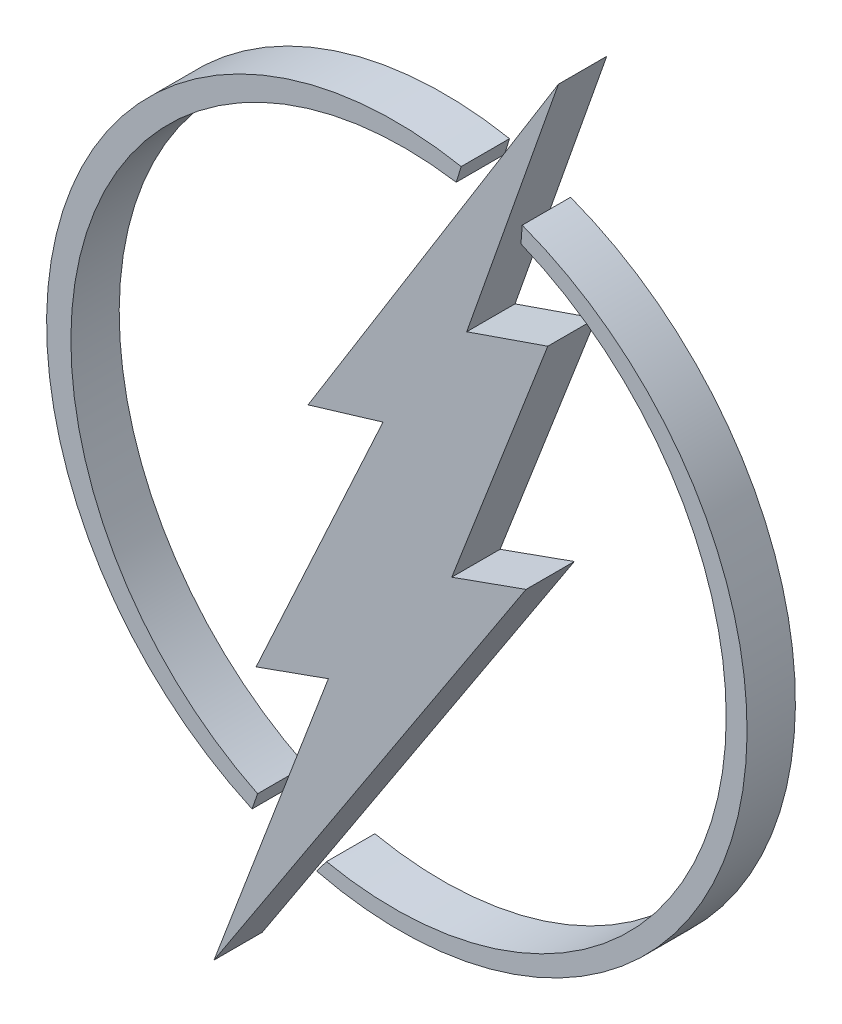
ISO-10303-21;
HEADER;
FILE_DESCRIPTION(('STEP AP214'),'2;1');
FILE_NAME('part.step','',(''),(''),'','','');
FILE_SCHEMA(('AUTOMOTIVE_DESIGN { 1 0 10303 214 1 1 1 1 }'));
ENDSEC;
DATA;
#1=APPLICATION_CONTEXT('core data for automotive mechanical design processes');
#2=APPLICATION_PROTOCOL_DEFINITION('international standard','automotive_design',2000,#1);
#3=PRODUCT_CONTEXT('',#1,'mechanical');
#4=PRODUCT('Part','Part','',(#3));
#5=PRODUCT_RELATED_PRODUCT_CATEGORY('part','',(#4));
#6=PRODUCT_DEFINITION_FORMATION('','',#4);
#7=PRODUCT_DEFINITION_CONTEXT('part definition',#1,'design');
#8=PRODUCT_DEFINITION('design','',#6,#7);
#9=PRODUCT_DEFINITION_SHAPE('','',#8);
#10=(LENGTH_UNIT() NAMED_UNIT(*) SI_UNIT(.MILLI.,.METRE.));
#11=(NAMED_UNIT(*) PLANE_ANGLE_UNIT() SI_UNIT($,.RADIAN.));
#12=(NAMED_UNIT(*) SI_UNIT($,.STERADIAN.) SOLID_ANGLE_UNIT());
#13=UNCERTAINTY_MEASURE_WITH_UNIT(LENGTH_MEASURE(1.E-05),#10,'distance_accuracy_value','');
#14=(GEOMETRIC_REPRESENTATION_CONTEXT(3) GLOBAL_UNCERTAINTY_ASSIGNED_CONTEXT((#13)) GLOBAL_UNIT_ASSIGNED_CONTEXT((#10,
#11,#12)) REPRESENTATION_CONTEXT('',''));
#15=CARTESIAN_POINT('',(0.,0.,0.));
#16=DIRECTION('',(0.,0.,1.));
#17=DIRECTION('',(1.,0.,0.));
#18=AXIS2_PLACEMENT_3D('',#15,#16,#17);
#19=CARTESIAN_POINT('',(5.5754752399908,6.72812446151738,1.4));
#20=DIRECTION('',(-0.943131605548492,0.332419576161698,0.));
#21=DIRECTION('',(-0.332419576161698,-0.943131605548492,0.));
#22=AXIS2_PLACEMENT_3D('',#19,#20,#21);
#23=PLANE('',#22);
#24=DIRECTION('',(0.332419576161698,0.943131605548492,0.));
#25=VECTOR('',#24,1.);
#26=CARTESIAN_POINT('',(5.5754752399908,6.72812446151738,1.));
#27=LINE('',#26,#25);
#28=CARTESIAN_POINT('',(5.5754752399908,6.72812446151738,1.));
#29=VERTEX_POINT('',#28);
#30=CARTESIAN_POINT('',(6.33493174900757,8.88283341387108,1.));
#31=VERTEX_POINT('',#30);
#32=EDGE_CURVE('E96',#29,#31,#27,.T.);
#33=ORIENTED_EDGE('',*,*,#32,.T.);
#34=DIRECTION('',(0.,0.,-1.));
#35=VECTOR('',#34,1.);
#36=CARTESIAN_POINT('',(6.33493174900757,8.88283341387108,1.4));
#37=LINE('',#36,#35);
#38=CARTESIAN_POINT('',(6.33493174900757,8.88283341387108,1.4));
#39=VERTEX_POINT('',#38);
#40=EDGE_CURVE('E129',#39,#31,#37,.T.);
#41=ORIENTED_EDGE('',*,*,#40,.F.);
#42=DIRECTION('',(0.332419576161698,0.943131605548492,0.));
#43=VECTOR('',#42,1.);
#44=CARTESIAN_POINT('',(5.5754752399908,6.72812446151738,1.4));
#45=LINE('',#44,#43);
#46=CARTESIAN_POINT('',(5.5754752399908,6.72812446151738,1.4));
#47=VERTEX_POINT('',#46);
#48=EDGE_CURVE('E48',#47,#39,#45,.T.);
#49=ORIENTED_EDGE('',*,*,#48,.F.);
#50=DIRECTION('',(0.,0.,-1.));
#51=VECTOR('',#50,1.);
#52=CARTESIAN_POINT('',(5.5754752399908,6.72812446151738,1.4));
#53=LINE('',#52,#51);
#54=EDGE_CURVE('E145',#47,#29,#53,.T.);
#55=ORIENTED_EDGE('',*,*,#54,.T.);
#56=EDGE_LOOP('',(#33,#41,#49,#55));
#57=FACE_BOUND('',#56,.T.);
#58=ADVANCED_FACE('F44',(#57),#23,.F.);
#59=CARTESIAN_POINT('',(6.33493174900757,8.88283341387108,1.4));
#60=DIRECTION('',(0.84935263624183,-0.527825822889571,0.));
#61=DIRECTION('',(0.527825822889571,0.84935263624183,0.));
#62=AXIS2_PLACEMENT_3D('',#59,#60,#61);
#63=PLANE('',#62);
#64=DIRECTION('',(-0.527825822889571,-0.84935263624183,0.));
#65=VECTOR('',#64,1.);
#66=CARTESIAN_POINT('',(6.33493174900757,8.88283341387108,1.));
#67=LINE('',#66,#65);
#68=CARTESIAN_POINT('',(4.26218458627314,5.54746558875507,1.));
#69=VERTEX_POINT('',#68);
#70=EDGE_CURVE('E63',#31,#69,#67,.T.);
#71=ORIENTED_EDGE('',*,*,#70,.T.);
#72=DIRECTION('',(0.,0.,-1.));
#73=VECTOR('',#72,1.);
#74=CARTESIAN_POINT('',(4.26218458627314,5.54746558875507,1.4));
#75=LINE('',#74,#73);
#76=CARTESIAN_POINT('',(4.26218458627314,5.54746558875507,1.4));
#77=VERTEX_POINT('',#76);
#78=EDGE_CURVE('E131',#77,#69,#75,.T.);
#79=ORIENTED_EDGE('',*,*,#78,.F.);
#80=DIRECTION('',(-0.527825822889571,-0.84935263624183,0.));
#81=VECTOR('',#80,1.);
#82=CARTESIAN_POINT('',(6.33493174900757,8.88283341387108,1.4));
#83=LINE('',#82,#81);
#84=EDGE_CURVE('E124',#39,#77,#83,.T.);
#85=ORIENTED_EDGE('',*,*,#84,.F.);
#86=ORIENTED_EDGE('',*,*,#40,.T.);
#87=EDGE_LOOP('',(#71,#79,#85,#86));
#88=FACE_BOUND('',#87,.T.);
#89=ADVANCED_FACE('F127',(#88),#63,.F.);
#90=CARTESIAN_POINT('',(4.26218458627314,5.54746558875507,1.4));
#91=DIRECTION('',(-0.287998020817134,0.957631004095739,0.));
#92=DIRECTION('',(-0.957631004095739,-0.287998020817134,0.));
#93=AXIS2_PLACEMENT_3D('',#90,#91,#92);
#94=PLANE('',#93);
#95=DIRECTION('',(0.957631004095739,0.287998020817134,0.));
#96=VECTOR('',#95,1.);
#97=CARTESIAN_POINT('',(4.26218458627314,5.54746558875507,1.));
#98=LINE('',#97,#96);
#99=CARTESIAN_POINT('',(4.88283020195723,5.73411859829775,1.));
#100=VERTEX_POINT('',#99);
#101=EDGE_CURVE('E141',#69,#100,#98,.T.);
#102=ORIENTED_EDGE('',*,*,#101,.T.);
#103=DIRECTION('',(0.,0.,-1.));
#104=VECTOR('',#103,1.);
#105=CARTESIAN_POINT('',(4.88283020195723,5.73411859829775,1.4));
#106=LINE('',#105,#104);
#107=CARTESIAN_POINT('',(4.88283020195723,5.73411859829775,1.4));
#108=VERTEX_POINT('',#107);
#109=EDGE_CURVE('E150',#108,#100,#106,.T.);
#110=ORIENTED_EDGE('',*,*,#109,.F.);
#111=DIRECTION('',(0.957631004095739,0.287998020817134,0.));
#112=VECTOR('',#111,1.);
#113=CARTESIAN_POINT('',(4.26218458627314,5.54746558875507,1.4));
#114=LINE('',#113,#112);
#115=EDGE_CURVE('E133',#77,#108,#114,.T.);
#116=ORIENTED_EDGE('',*,*,#115,.F.);
#117=ORIENTED_EDGE('',*,*,#78,.T.);
#118=EDGE_LOOP('',(#102,#110,#116,#117));
#119=FACE_BOUND('',#118,.T.);
#120=ADVANCED_FACE('F202',(#119),#94,.F.);
#121=CARTESIAN_POINT('',(4.88283020195723,5.73411859829775,1.4));
#122=DIRECTION('',(0.908219929787825,-0.418493200824336,0.));
#123=DIRECTION('',(0.418493200824336,0.908219929787825,0.));
#124=AXIS2_PLACEMENT_3D('',#121,#122,#123);
#125=PLANE('',#124);
#126=DIRECTION('',(-0.418493200824336,-0.908219929787825,0.));
#127=VECTOR('',#126,1.);
#128=CARTESIAN_POINT('',(4.88283020195723,5.73411859829775,1.));
#129=LINE('',#128,#127);
#130=CARTESIAN_POINT('',(3.83224500450119,3.4541235771357,1.));
#131=VERTEX_POINT('',#130);
#132=EDGE_CURVE('E149',#100,#131,#129,.T.);
#133=ORIENTED_EDGE('',*,*,#132,.T.);
#134=DIRECTION('',(0.,0.,-1.));
#135=VECTOR('',#134,1.);
#136=CARTESIAN_POINT('',(3.83224500450119,3.4541235771357,1.4));
#137=LINE('',#136,#135);
#138=CARTESIAN_POINT('',(3.83224500450119,3.4541235771357,1.4));
#139=VERTEX_POINT('',#138);
#140=EDGE_CURVE('E154',#139,#131,#137,.T.);
#141=ORIENTED_EDGE('',*,*,#140,.F.);
#142=DIRECTION('',(-0.418493200824336,-0.908219929787825,0.));
#143=VECTOR('',#142,1.);
#144=CARTESIAN_POINT('',(4.88283020195723,5.73411859829775,1.4));
#145=LINE('',#144,#143);
#146=EDGE_CURVE('E196',#108,#139,#145,.T.);
#147=ORIENTED_EDGE('',*,*,#146,.F.);
#148=ORIENTED_EDGE('',*,*,#109,.T.);
#149=EDGE_LOOP('',(#133,#141,#147,#148));
#150=FACE_BOUND('',#149,.T.);
#151=ADVANCED_FACE('F204',(#150),#125,.F.);
#152=CARTESIAN_POINT('',(3.83224500450119,3.4541235771357,1.4));
#153=DIRECTION('',(-0.336931622172441,0.941529119029384,0.));
#154=DIRECTION('',(-0.941529119029384,-0.336931622172441,0.));
#155=AXIS2_PLACEMENT_3D('',#152,#153,#154);
#156=PLANE('',#155);
#157=DIRECTION('',(0.941529119029384,0.336931622172441,0.));
#158=VECTOR('',#157,1.);
#159=CARTESIAN_POINT('',(3.83224500450119,3.4541235771357,1.));
#160=LINE('',#159,#158);
#161=CARTESIAN_POINT('',(4.43034059659642,3.66815553216071,1.));
#162=VERTEX_POINT('',#161);
#163=EDGE_CURVE('E153',#131,#162,#160,.T.);
#164=ORIENTED_EDGE('',*,*,#163,.T.);
#165=DIRECTION('',(0.,0.,-1.));
#166=VECTOR('',#165,1.);
#167=CARTESIAN_POINT('',(4.43034059659642,3.66815553216071,1.4));
#168=LINE('',#167,#166);
#169=CARTESIAN_POINT('',(4.43034059659642,3.66815553216071,1.4));
#170=VERTEX_POINT('',#169);
#171=EDGE_CURVE('E158',#170,#162,#168,.T.);
#172=ORIENTED_EDGE('',*,*,#171,.F.);
#173=DIRECTION('',(0.941529119029384,0.336931622172441,0.));
#174=VECTOR('',#173,1.);
#175=CARTESIAN_POINT('',(3.83224500450119,3.4541235771357,1.4));
#176=LINE('',#175,#174);
#177=EDGE_CURVE('E194',#139,#170,#176,.T.);
#178=ORIENTED_EDGE('',*,*,#177,.F.);
#179=ORIENTED_EDGE('',*,*,#140,.T.);
#180=EDGE_LOOP('',(#164,#172,#178,#179));
#181=FACE_BOUND('',#180,.T.);
#182=ADVANCED_FACE('F208',(#181),#156,.F.);
#183=CARTESIAN_POINT('',(4.43034059659642,3.66815553216071,1.4));
#184=DIRECTION('',(0.934740049512654,-0.355332294953725,0.));
#185=DIRECTION('',(0.355332294953725,0.934740049512654,0.));
#186=AXIS2_PLACEMENT_3D('',#183,#184,#185);
#187=PLANE('',#186);
#188=DIRECTION('',(-0.355332294953725,-0.934740049512654,0.));
#189=VECTOR('',#188,1.);
#190=CARTESIAN_POINT('',(4.43034059659642,3.66815553216071,1.));
#191=LINE('',#190,#189);
#192=CARTESIAN_POINT('',(3.48350957483978,1.17741408049454,1.));
#193=VERTEX_POINT('',#192);
#194=EDGE_CURVE('E157',#162,#193,#191,.T.);
#195=ORIENTED_EDGE('',*,*,#194,.T.);
#196=DIRECTION('',(0.,0.,-1.));
#197=VECTOR('',#196,1.);
#198=CARTESIAN_POINT('',(3.48350957483978,1.17741408049454,1.4));
#199=LINE('',#198,#197);
#200=CARTESIAN_POINT('',(3.48350957483978,1.17741408049454,1.4));
#201=VERTEX_POINT('',#200);
#202=EDGE_CURVE('E162',#201,#193,#199,.T.);
#203=ORIENTED_EDGE('',*,*,#202,.F.);
#204=DIRECTION('',(-0.355332294953725,-0.934740049512654,0.));
#205=VECTOR('',#204,1.);
#206=CARTESIAN_POINT('',(4.43034059659642,3.66815553216071,1.4));
#207=LINE('',#206,#205);
#208=EDGE_CURVE('E192',#170,#201,#207,.T.);
#209=ORIENTED_EDGE('',*,*,#208,.F.);
#210=ORIENTED_EDGE('',*,*,#171,.T.);
#211=EDGE_LOOP('',(#195,#203,#209,#210));
#212=FACE_BOUND('',#211,.T.);
#213=ADVANCED_FACE('F214',(#212),#187,.F.);
#214=CARTESIAN_POINT('',(3.48350957483978,1.17741408049454,1.4));
#215=DIRECTION('',(-0.83688934810245,0.547372102899532,0.));
#216=DIRECTION('',(-0.547372102899532,-0.83688934810245,0.));
#217=AXIS2_PLACEMENT_3D('',#214,#215,#216);
#218=PLANE('',#217);
#219=DIRECTION('',(0.547372102899532,0.83688934810245,0.));
#220=VECTOR('',#219,1.);
#221=CARTESIAN_POINT('',(3.48350957483978,1.17741408049454,1.));
#222=LINE('',#221,#220);
#223=CARTESIAN_POINT('',(6.06665986387478,5.12684984821021,1.));
#224=VERTEX_POINT('',#223);
#225=EDGE_CURVE('E161',#193,#224,#222,.T.);
#226=ORIENTED_EDGE('',*,*,#225,.T.);
#227=DIRECTION('',(0.,0.,-1.));
#228=VECTOR('',#227,1.);
#229=CARTESIAN_POINT('',(6.06665986387478,5.12684984821021,1.4));
#230=LINE('',#229,#228);
#231=CARTESIAN_POINT('',(6.06665986387478,5.12684984821021,1.4));
#232=VERTEX_POINT('',#231);
#233=EDGE_CURVE('E166',#232,#224,#230,.T.);
#234=ORIENTED_EDGE('',*,*,#233,.F.);
#235=DIRECTION('',(0.547372102899532,0.83688934810245,0.));
#236=VECTOR('',#235,1.);
#237=CARTESIAN_POINT('',(3.48350957483978,1.17741408049454,1.4));
#238=LINE('',#237,#236);
#239=EDGE_CURVE('E190',#201,#232,#238,.T.);
#240=ORIENTED_EDGE('',*,*,#239,.F.);
#241=ORIENTED_EDGE('',*,*,#202,.T.);
#242=EDGE_LOOP('',(#226,#234,#240,#241));
#243=FACE_BOUND('',#242,.T.);
#244=ADVANCED_FACE('F216',(#243),#218,.F.);
#245=CARTESIAN_POINT('',(6.06665986387478,5.12684984821021,1.4));
#246=DIRECTION('',(0.336931622172441,-0.941529119029384,0.));
#247=DIRECTION('',(0.941529119029384,0.336931622172441,0.));
#248=AXIS2_PLACEMENT_3D('',#245,#246,#247);
#249=PLANE('',#248);
#250=DIRECTION('',(-0.941529119029384,-0.336931622172441,0.));
#251=VECTOR('',#250,1.);
#252=CARTESIAN_POINT('',(6.06665986387478,5.12684984821021,1.));
#253=LINE('',#252,#251);
#254=CARTESIAN_POINT('',(5.45168227068719,4.90677657178728,1.));
#255=VERTEX_POINT('',#254);
#256=EDGE_CURVE('E165',#224,#255,#253,.T.);
#257=ORIENTED_EDGE('',*,*,#256,.T.);
#258=DIRECTION('',(0.,0.,-1.));
#259=VECTOR('',#258,1.);
#260=CARTESIAN_POINT('',(5.45168227068719,4.90677657178728,1.4));
#261=LINE('',#260,#259);
#262=CARTESIAN_POINT('',(5.45168227068719,4.90677657178728,1.4));
#263=VERTEX_POINT('',#262);
#264=EDGE_CURVE('E169',#263,#255,#261,.T.);
#265=ORIENTED_EDGE('',*,*,#264,.F.);
#266=DIRECTION('',(-0.941529119029384,-0.336931622172441,0.));
#267=VECTOR('',#266,1.);
#268=CARTESIAN_POINT('',(6.06665986387478,5.12684984821021,1.4));
#269=LINE('',#268,#267);
#270=EDGE_CURVE('E188',#232,#263,#269,.T.);
#271=ORIENTED_EDGE('',*,*,#270,.F.);
#272=ORIENTED_EDGE('',*,*,#233,.T.);
#273=EDGE_LOOP('',(#257,#265,#271,#272));
#274=FACE_BOUND('',#273,.T.);
#275=ADVANCED_FACE('F220',(#274),#249,.F.);
#276=CARTESIAN_POINT('',(5.45168227068719,4.90677657178728,1.4));
#277=DIRECTION('',(-0.932545562157118,0.361052315462821,0.));
#278=DIRECTION('',(-0.361052315462821,-0.932545562157118,0.));
#279=AXIS2_PLACEMENT_3D('',#276,#277,#278);
#280=PLANE('',#279);
#281=DIRECTION('',(0.361052315462821,0.932545562157118,0.));
#282=VECTOR('',#281,1.);
#283=CARTESIAN_POINT('',(5.45168227068719,4.90677657178728,1.));
#284=LINE('',#283,#282);
#285=CARTESIAN_POINT('',(6.24671541544286,6.96023142904068,1.));
#286=VERTEX_POINT('',#285);
#287=EDGE_CURVE('E88',#255,#286,#284,.T.);
#288=ORIENTED_EDGE('',*,*,#287,.T.);
#289=DIRECTION('',(0.,0.,-1.));
#290=VECTOR('',#289,1.);
#291=CARTESIAN_POINT('',(6.24671541544286,6.96023142904068,1.4));
#292=LINE('',#291,#290);
#293=CARTESIAN_POINT('',(6.24671541544286,6.96023142904068,1.4));
#294=VERTEX_POINT('',#293);
#295=EDGE_CURVE('E140',#294,#286,#292,.T.);
#296=ORIENTED_EDGE('',*,*,#295,.F.);
#297=DIRECTION('',(0.361052315462821,0.932545562157118,0.));
#298=VECTOR('',#297,1.);
#299=CARTESIAN_POINT('',(5.45168227068719,4.90677657178728,1.4));
#300=LINE('',#299,#298);
#301=EDGE_CURVE('E54',#263,#294,#300,.T.);
#302=ORIENTED_EDGE('',*,*,#301,.F.);
#303=ORIENTED_EDGE('',*,*,#264,.T.);
#304=EDGE_LOOP('',(#288,#296,#302,#303));
#305=FACE_BOUND('',#304,.T.);
#306=ADVANCED_FACE('F224',(#305),#280,.F.);
#307=CARTESIAN_POINT('',(6.24671541544286,6.96023142904068,1.4));
#308=DIRECTION('',(0.32680199790554,-0.945092828332195,0.));
#309=DIRECTION('',(0.945092828332195,0.32680199790554,0.));
#310=AXIS2_PLACEMENT_3D('',#307,#308,#309);
#311=PLANE('',#310);
#312=DIRECTION('',(-0.945092828332195,-0.32680199790554,0.));
#313=VECTOR('',#312,1.);
#314=CARTESIAN_POINT('',(6.24671541544286,6.96023142904068,1.));
#315=LINE('',#314,#313);
#316=EDGE_CURVE('E92',#286,#29,#315,.T.);
#317=ORIENTED_EDGE('',*,*,#316,.T.);
#318=ORIENTED_EDGE('',*,*,#54,.F.);
#319=DIRECTION('',(-0.945092828332195,-0.32680199790554,0.));
#320=VECTOR('',#319,1.);
#321=CARTESIAN_POINT('',(6.24671541544286,6.96023142904068,1.4));
#322=LINE('',#321,#320);
#323=EDGE_CURVE('E12',#294,#47,#322,.T.);
#324=ORIENTED_EDGE('',*,*,#323,.F.);
#325=ORIENTED_EDGE('',*,*,#295,.T.);
#326=EDGE_LOOP('',(#317,#318,#324,#325));
#327=FACE_BOUND('',#326,.T.);
#328=ADVANCED_FACE('F226',(#327),#311,.F.);
#329=CARTESIAN_POINT('',(0.,0.,1.4));
#330=DIRECTION('',(0.,0.,-1.));
#331=DIRECTION('',(-1.,0.,0.));
#332=AXIS2_PLACEMENT_3D('',#329,#330,#331);
#333=PLANE('',#332);
#334=ORIENTED_EDGE('',*,*,#48,.T.);
#335=ORIENTED_EDGE('',*,*,#84,.T.);
#336=ORIENTED_EDGE('',*,*,#115,.T.);
#337=ORIENTED_EDGE('',*,*,#146,.T.);
#338=ORIENTED_EDGE('',*,*,#177,.T.);
#339=ORIENTED_EDGE('',*,*,#208,.T.);
#340=ORIENTED_EDGE('',*,*,#239,.T.);
#341=ORIENTED_EDGE('',*,*,#270,.T.);
#342=ORIENTED_EDGE('',*,*,#301,.T.);
#343=ORIENTED_EDGE('',*,*,#323,.T.);
#344=EDGE_LOOP('',(#334,#335,#336,#337,#338,#339,#340,#341,#342,#343));
#345=FACE_BOUND('',#344,.T.);
#346=ADVANCED_FACE('F135',(#345),#333,.F.);
#347=CARTESIAN_POINT('',(0.,0.,1.));
#348=DIRECTION('',(0.,0.,-1.));
#349=DIRECTION('',(-1.,0.,0.));
#350=AXIS2_PLACEMENT_3D('',#347,#348,#349);
#351=PLANE('',#350);
#352=ORIENTED_EDGE('',*,*,#32,.F.);
#353=ORIENTED_EDGE('',*,*,#316,.F.);
#354=ORIENTED_EDGE('',*,*,#287,.F.);
#355=ORIENTED_EDGE('',*,*,#256,.F.);
#356=ORIENTED_EDGE('',*,*,#225,.F.);
#357=ORIENTED_EDGE('',*,*,#194,.F.);
#358=ORIENTED_EDGE('',*,*,#163,.F.);
#359=ORIENTED_EDGE('',*,*,#132,.F.);
#360=ORIENTED_EDGE('',*,*,#101,.F.);
#361=ORIENTED_EDGE('',*,*,#70,.F.);
#362=EDGE_LOOP('',(#352,#353,#354,#355,#356,#357,#358,#359,#360,#361));
#363=FACE_BOUND('',#362,.T.);
#364=ADVANCED_FACE('F46',(#363),#351,.T.);
#365=CLOSED_SHELL('',(#58,#89,#120,#151,#182,#213,#244,#275,#306,#328,#346,#364));
#366=MANIFOLD_SOLID_BREP('B2',#365);
#367=CARTESIAN_POINT('',(5.05914994349455,5.02952218568989,1.4));
#368=DIRECTION('',(0.,0.,1.));
#369=DIRECTION('',(1.,0.,0.));
#370=AXIS2_PLACEMENT_3D('',#367,#368,#369);
#371=PLANE('',#370);
#372=CARTESIAN_POINT('',(5.05914994349455,5.02952218568989,1.4));
#373=DIRECTION('',(0.,0.,-1.));
#374=DIRECTION('',(1.,0.,0.));
#375=AXIS2_PLACEMENT_3D('',#372,#373,#374);
#376=CIRCLE('',#375,2.76040884083673);
#377=CARTESIAN_POINT('',(3.84441176195249,2.55075876033573,1.4));
#378=VERTEX_POINT('',#377);
#379=CARTESIAN_POINT('',(5.48850418447344,7.75633569312362,1.4));
#380=VERTEX_POINT('',#379);
#381=EDGE_CURVE('E337',#378,#380,#376,.T.);
#382=ORIENTED_EDGE('',*,*,#381,.T.);
#383=DIRECTION('',(0.297546452170526,0.954707341964402,0.));
#384=VECTOR('',#383,1.);
#385=CARTESIAN_POINT('',(5.53016977084519,7.89002386492399,1.4));
#386=LINE('',#385,#384);
#387=CARTESIAN_POINT('',(5.53016977084519,7.89002386492399,1.4));
#388=VERTEX_POINT('',#387);
#389=EDGE_CURVE('E399',#380,#388,#386,.T.);
#390=ORIENTED_EDGE('',*,*,#389,.T.);
#391=CARTESIAN_POINT('',(4.98710817993812,5.05213931217201,1.4));
#392=DIRECTION('',(0.,0.,1.));
#393=DIRECTION('',(-1.,0.,0.));
#394=AXIS2_PLACEMENT_3D('',#391,#392,#393);
#395=CIRCLE('',#394,2.88937789606462);
#396=CARTESIAN_POINT('',(3.79849213367489,2.41856825354603,1.4));
#397=VERTEX_POINT('',#396);
#398=EDGE_CURVE('E398',#388,#397,#395,.T.);
#399=ORIENTED_EDGE('',*,*,#398,.T.);
#400=DIRECTION('',(0.328140164216985,0.944629044984141,0.));
#401=VECTOR('',#400,1.);
#402=CARTESIAN_POINT('',(3.79849213367489,2.41856825354603,1.4));
#403=LINE('',#402,#401);
#404=EDGE_CURVE('E378',#397,#378,#403,.T.);
#405=ORIENTED_EDGE('',*,*,#404,.T.);
#406=EDGE_LOOP('',(#382,#390,#399,#405));
#407=FACE_BOUND('',#406,.T.);
#408=ADVANCED_FACE('F333',(#407),#371,.T.);
#409=CARTESIAN_POINT('',(3.79849213367489,2.41856825354603,1.4));
#410=DIRECTION('',(-0.944629044984141,0.328140164216985,0.));
#411=DIRECTION('',(-0.328140164216985,-0.944629044984141,0.));
#412=AXIS2_PLACEMENT_3D('',#409,#410,#411);
#413=PLANE('',#412);
#414=DIRECTION('',(0.328140164216985,0.944629044984141,0.));
#415=VECTOR('',#414,1.);
#416=CARTESIAN_POINT('',(3.79849213367489,2.41856825354603,1.));
#417=LINE('',#416,#415);
#418=CARTESIAN_POINT('',(3.79849213367489,2.41856825354603,1.));
#419=VERTEX_POINT('',#418);
#420=CARTESIAN_POINT('',(3.84441176195249,2.55075876033573,1.));
#421=VERTEX_POINT('',#420);
#422=EDGE_CURVE('E371',#419,#421,#417,.T.);
#423=ORIENTED_EDGE('',*,*,#422,.T.);
#424=DIRECTION('',(0.,0.,-1.));
#425=VECTOR('',#424,1.);
#426=CARTESIAN_POINT('',(3.84441176195249,2.55075876033573,1.4));
#427=LINE('',#426,#425);
#428=EDGE_CURVE('E42',#378,#421,#427,.T.);
#429=ORIENTED_EDGE('',*,*,#428,.F.);
#430=ORIENTED_EDGE('',*,*,#404,.F.);
#431=DIRECTION('',(0.,0.,-1.));
#432=VECTOR('',#431,1.);
#433=CARTESIAN_POINT('',(3.79849213367489,2.41856825354603,1.4));
#434=LINE('',#433,#432);
#435=EDGE_CURVE('E377',#397,#419,#434,.T.);
#436=ORIENTED_EDGE('',*,*,#435,.T.);
#437=EDGE_LOOP('',(#423,#429,#430,#436));
#438=FACE_BOUND('',#437,.T.);
#439=ADVANCED_FACE('F389',(#438),#413,.F.);
#440=CARTESIAN_POINT('',(4.98710817993812,5.05213931217201,1.4));
#441=DIRECTION('',(0.,0.,-1.));
#442=DIRECTION('',(-1.,0.,0.));
#443=AXIS2_PLACEMENT_3D('',#440,#441,#442);
#444=CYLINDRICAL_SURFACE('',#443,2.88937789606462);
#445=CARTESIAN_POINT('',(4.98710817993812,5.05213931217201,1.));
#446=DIRECTION('',(0.,0.,1.));
#447=DIRECTION('',(-1.,0.,0.));
#448=AXIS2_PLACEMENT_3D('',#445,#446,#447);
#449=CIRCLE('',#448,2.88937789606462);
#450=CARTESIAN_POINT('',(5.53016977084519,7.89002386492399,1.));
#451=VERTEX_POINT('',#450);
#452=EDGE_CURVE('E373',#451,#419,#449,.T.);
#453=ORIENTED_EDGE('',*,*,#452,.T.);
#454=ORIENTED_EDGE('',*,*,#435,.F.);
#455=ORIENTED_EDGE('',*,*,#398,.F.);
#456=DIRECTION('',(0.,0.,-1.));
#457=VECTOR('',#456,1.);
#458=CARTESIAN_POINT('',(5.53016977084519,7.89002386492399,1.4));
#459=LINE('',#458,#457);
#460=EDGE_CURVE('E387',#388,#451,#459,.T.);
#461=ORIENTED_EDGE('',*,*,#460,.T.);
#462=EDGE_LOOP('',(#453,#454,#455,#461));
#463=FACE_BOUND('',#462,.T.);
#464=ADVANCED_FACE('F383',(#463),#444,.T.);
#465=CARTESIAN_POINT('',(5.53016977084519,7.89002386492399,1.4));
#466=DIRECTION('',(-0.954707341964402,0.297546452170525,0.));
#467=DIRECTION('',(-0.297546452170525,-0.954707341964402,0.));
#468=AXIS2_PLACEMENT_3D('',#465,#466,#467);
#469=PLANE('',#468);
#470=DIRECTION('',(0.297546452170526,0.954707341964402,0.));
#471=VECTOR('',#470,1.);
#472=CARTESIAN_POINT('',(5.53016977084519,7.89002386492399,1.));
#473=LINE('',#472,#471);
#474=CARTESIAN_POINT('',(5.48850418447344,7.75633569312362,1.));
#475=VERTEX_POINT('',#474);
#476=EDGE_CURVE('E352',#475,#451,#473,.T.);
#477=ORIENTED_EDGE('',*,*,#476,.T.);
#478=ORIENTED_EDGE('',*,*,#460,.F.);
#479=ORIENTED_EDGE('',*,*,#389,.F.);
#480=DIRECTION('',(0.,0.,-1.));
#481=VECTOR('',#480,1.);
#482=CARTESIAN_POINT('',(5.48850418447344,7.75633569312362,1.4));
#483=LINE('',#482,#481);
#484=EDGE_CURVE('E395',#380,#475,#483,.T.);
#485=ORIENTED_EDGE('',*,*,#484,.T.);
#486=EDGE_LOOP('',(#477,#478,#479,#485));
#487=FACE_BOUND('',#486,.T.);
#488=ADVANCED_FACE('F407',(#487),#469,.F.);
#489=CARTESIAN_POINT('',(5.05914994349455,5.02952218568989,1.4));
#490=DIRECTION('',(0.,0.,-1.));
#491=DIRECTION('',(-1.,0.,0.));
#492=AXIS2_PLACEMENT_3D('',#489,#490,#491);
#493=CYLINDRICAL_SURFACE('',#492,2.76040884083673);
#494=CARTESIAN_POINT('',(5.05914994349455,5.02952218568989,1.));
#495=DIRECTION('',(0.,0.,-1.));
#496=DIRECTION('',(1.,0.,0.));
#497=AXIS2_PLACEMENT_3D('',#494,#495,#496);
#498=CIRCLE('',#497,2.76040884083673);
#499=EDGE_CURVE('E343',#421,#475,#498,.T.);
#500=ORIENTED_EDGE('',*,*,#499,.T.);
#501=ORIENTED_EDGE('',*,*,#484,.F.);
#502=ORIENTED_EDGE('',*,*,#381,.F.);
#503=ORIENTED_EDGE('',*,*,#428,.T.);
#504=EDGE_LOOP('',(#500,#501,#502,#503));
#505=FACE_BOUND('',#504,.T.);
#506=ADVANCED_FACE('F405',(#505),#493,.F.);
#507=CARTESIAN_POINT('',(0.,0.,1.));
#508=DIRECTION('',(0.,0.,-1.));
#509=DIRECTION('',(-1.,0.,0.));
#510=AXIS2_PLACEMENT_3D('',#507,#508,#509);
#511=PLANE('',#510);
#512=ORIENTED_EDGE('',*,*,#499,.F.);
#513=ORIENTED_EDGE('',*,*,#422,.F.);
#514=ORIENTED_EDGE('',*,*,#452,.F.);
#515=ORIENTED_EDGE('',*,*,#476,.F.);
#516=EDGE_LOOP('',(#512,#513,#514,#515));
#517=FACE_BOUND('',#516,.T.);
#518=ADVANCED_FACE('F335',(#517),#511,.T.);
#519=CLOSED_SHELL('',(#408,#439,#464,#488,#506,#518));
#520=MANIFOLD_SOLID_BREP('B6',#519);
#521=CARTESIAN_POINT('',(5.02169165891347,5.03218816207093,1.4));
#522=DIRECTION('',(0.,0.,-1.));
#523=DIRECTION('',(-1.,0.,0.));
#524=AXIS2_PLACEMENT_3D('',#521,#522,#523);
#525=PLANE('',#524);
#526=CARTESIAN_POINT('',(5.02169165891347,5.03218816207093,1.4));
#527=DIRECTION('',(0.,0.,1.));
#528=DIRECTION('',(-1.,0.,0.));
#529=AXIS2_PLACEMENT_3D('',#526,#527,#528);
#530=CIRCLE('',#529,2.87476036646796);
#531=CARTESIAN_POINT('',(4.33325402482021,2.24107713085431,1.4));
#532=VERTEX_POINT('',#531);
#533=CARTESIAN_POINT('',(6.0352377506101,7.72235014318312,1.4));
#534=VERTEX_POINT('',#533);
#535=EDGE_CURVE('E504',#532,#534,#530,.T.);
#536=ORIENTED_EDGE('',*,*,#535,.T.);
#537=DIRECTION('',(-0.0772074385865055,-0.99701505075245,0.));
#538=VECTOR('',#537,1.);
#539=CARTESIAN_POINT('',(6.02444218329046,7.58294203308196,1.4));
#540=LINE('',#539,#538);
#541=CARTESIAN_POINT('',(6.02444218329046,7.58294203308196,1.4));
#542=VERTEX_POINT('',#541);
#543=EDGE_CURVE('E525',#534,#542,#540,.T.);
#544=ORIENTED_EDGE('',*,*,#543,.T.);
#545=CARTESIAN_POINT('',(4.97402403943136,5.04176586294974,1.4));
#546=DIRECTION('',(0.,0.,-1.));
#547=DIRECTION('',(1.,0.,0.));
#548=AXIS2_PLACEMENT_3D('',#545,#546,#547);
#549=CIRCLE('',#548,2.74971900466143);
#550=CARTESIAN_POINT('',(4.4151419315952,2.34944244364499,1.4));
#551=VERTEX_POINT('',#550);
#552=EDGE_CURVE('E523',#542,#551,#549,.T.);
#553=ORIENTED_EDGE('',*,*,#552,.T.);
#554=DIRECTION('',(-0.602888826572247,-0.797825208171777,0.));
#555=VECTOR('',#554,1.);
#556=CARTESIAN_POINT('',(4.4151419315952,2.34944244364499,1.4));
#557=LINE('',#556,#555);
#558=EDGE_CURVE('E473',#551,#532,#557,.T.);
#559=ORIENTED_EDGE('',*,*,#558,.T.);
#560=EDGE_LOOP('',(#536,#544,#553,#559));
#561=FACE_BOUND('',#560,.T.);
#562=ADVANCED_FACE('F457',(#561),#525,.F.);
#563=CARTESIAN_POINT('',(4.4151419315952,2.34944244364499,1.4));
#564=DIRECTION('',(0.797825208171777,-0.602888826572247,0.));
#565=DIRECTION('',(0.602888826572247,0.797825208171777,0.));
#566=AXIS2_PLACEMENT_3D('',#563,#564,#565);
#567=PLANE('',#566);
#568=DIRECTION('',(-0.602888826572247,-0.797825208171777,0.));
#569=VECTOR('',#568,1.);
#570=CARTESIAN_POINT('',(4.4151419315952,2.34944244364499,1.));
#571=LINE('',#570,#569);
#572=CARTESIAN_POINT('',(4.4151419315952,2.34944244364499,1.));
#573=VERTEX_POINT('',#572);
#574=CARTESIAN_POINT('',(4.33325402482021,2.24107713085431,1.));
#575=VERTEX_POINT('',#574);
#576=EDGE_CURVE('E494',#573,#575,#571,.T.);
#577=ORIENTED_EDGE('',*,*,#576,.T.);
#578=DIRECTION('',(0.,0.,-1.));
#579=VECTOR('',#578,1.);
#580=CARTESIAN_POINT('',(4.33325402482021,2.24107713085431,1.4));
#581=LINE('',#580,#579);
#582=EDGE_CURVE('E516',#532,#575,#581,.T.);
#583=ORIENTED_EDGE('',*,*,#582,.F.);
#584=ORIENTED_EDGE('',*,*,#558,.F.);
#585=DIRECTION('',(0.,0.,-1.));
#586=VECTOR('',#585,1.);
#587=CARTESIAN_POINT('',(4.4151419315952,2.34944244364499,1.4));
#588=LINE('',#587,#586);
#589=EDGE_CURVE('E511',#551,#573,#588,.T.);
#590=ORIENTED_EDGE('',*,*,#589,.T.);
#591=EDGE_LOOP('',(#577,#583,#584,#590));
#592=FACE_BOUND('',#591,.T.);
#593=ADVANCED_FACE('F515',(#592),#567,.F.);
#594=CARTESIAN_POINT('',(4.97402403943136,5.04176586294974,1.4));
#595=DIRECTION('',(0.,0.,-1.));
#596=DIRECTION('',(-1.,0.,0.));
#597=AXIS2_PLACEMENT_3D('',#594,#595,#596);
#598=CYLINDRICAL_SURFACE('',#597,2.74971900466143);
#599=CARTESIAN_POINT('',(4.97402403943136,5.04176586294974,1.));
#600=DIRECTION('',(0.,0.,-1.));
#601=DIRECTION('',(1.,0.,0.));
#602=AXIS2_PLACEMENT_3D('',#599,#600,#601);
#603=CIRCLE('',#602,2.74971900466143);
#604=CARTESIAN_POINT('',(6.02444218329046,7.58294203308196,1.));
#605=VERTEX_POINT('',#604);
#606=EDGE_CURVE('E497',#605,#573,#603,.T.);
#607=ORIENTED_EDGE('',*,*,#606,.T.);
#608=ORIENTED_EDGE('',*,*,#589,.F.);
#609=ORIENTED_EDGE('',*,*,#552,.F.);
#610=DIRECTION('',(0.,0.,-1.));
#611=VECTOR('',#610,1.);
#612=CARTESIAN_POINT('',(6.02444218329046,7.58294203308196,1.4));
#613=LINE('',#612,#611);
#614=EDGE_CURVE('E466',#542,#605,#613,.T.);
#615=ORIENTED_EDGE('',*,*,#614,.T.);
#616=EDGE_LOOP('',(#607,#608,#609,#615));
#617=FACE_BOUND('',#616,.T.);
#618=ADVANCED_FACE('F509',(#617),#598,.F.);
#619=CARTESIAN_POINT('',(6.02444218329046,7.58294203308196,1.4));
#620=DIRECTION('',(0.99701505075245,-0.0772074385865055,0.));
#621=DIRECTION('',(0.0772074385865055,0.99701505075245,0.));
#622=AXIS2_PLACEMENT_3D('',#619,#620,#621);
#623=PLANE('',#622);
#624=DIRECTION('',(-0.0772074385865055,-0.99701505075245,0.));
#625=VECTOR('',#624,1.);
#626=CARTESIAN_POINT('',(6.02444218329046,7.58294203308196,1.));
#627=LINE('',#626,#625);
#628=CARTESIAN_POINT('',(6.0352377506101,7.72235014318312,1.));
#629=VERTEX_POINT('',#628);
#630=EDGE_CURVE('E513',#629,#605,#627,.T.);
#631=ORIENTED_EDGE('',*,*,#630,.T.);
#632=ORIENTED_EDGE('',*,*,#614,.F.);
#633=ORIENTED_EDGE('',*,*,#543,.F.);
#634=DIRECTION('',(0.,0.,-1.));
#635=VECTOR('',#634,1.);
#636=CARTESIAN_POINT('',(6.0352377506101,7.72235014318312,1.4));
#637=LINE('',#636,#635);
#638=EDGE_CURVE('E331',#534,#629,#637,.T.);
#639=ORIENTED_EDGE('',*,*,#638,.T.);
#640=EDGE_LOOP('',(#631,#632,#633,#639));
#641=FACE_BOUND('',#640,.T.);
#642=ADVANCED_FACE('F531',(#641),#623,.F.);
#643=CARTESIAN_POINT('',(5.02169165891347,5.03218816207093,1.4));
#644=DIRECTION('',(0.,0.,-1.));
#645=DIRECTION('',(-1.,0.,0.));
#646=AXIS2_PLACEMENT_3D('',#643,#644,#645);
#647=CYLINDRICAL_SURFACE('',#646,2.87476036646796);
#648=CARTESIAN_POINT('',(5.02169165891347,5.03218816207093,1.));
#649=DIRECTION('',(0.,0.,1.));
#650=DIRECTION('',(-1.,0.,0.));
#651=AXIS2_PLACEMENT_3D('',#648,#649,#650);
#652=CIRCLE('',#651,2.87476036646796);
#653=EDGE_CURVE('E500',#575,#629,#652,.T.);
#654=ORIENTED_EDGE('',*,*,#653,.T.);
#655=ORIENTED_EDGE('',*,*,#638,.F.);
#656=ORIENTED_EDGE('',*,*,#535,.F.);
#657=ORIENTED_EDGE('',*,*,#582,.T.);
#658=EDGE_LOOP('',(#654,#655,#656,#657));
#659=FACE_BOUND('',#658,.T.);
#660=ADVANCED_FACE('F459',(#659),#647,.T.);
#661=CARTESIAN_POINT('',(0.,0.,1.));
#662=DIRECTION('',(0.,0.,-1.));
#663=DIRECTION('',(-1.,0.,0.));
#664=AXIS2_PLACEMENT_3D('',#661,#662,#663);
#665=PLANE('',#664);
#666=ORIENTED_EDGE('',*,*,#653,.F.);
#667=ORIENTED_EDGE('',*,*,#576,.F.);
#668=ORIENTED_EDGE('',*,*,#606,.F.);
#669=ORIENTED_EDGE('',*,*,#630,.F.);
#670=EDGE_LOOP('',(#666,#667,#668,#669));
#671=FACE_BOUND('',#670,.T.);
#672=ADVANCED_FACE('F496',(#671),#665,.T.);
#673=CLOSED_SHELL('',(#562,#593,#618,#642,#660,#672));
#674=MANIFOLD_SOLID_BREP('B36',#673);
#675=ADVANCED_BREP_SHAPE_REPRESENTATION('',(#18,#366,#520,#674),#14);
#676=SHAPE_DEFINITION_REPRESENTATION(#9,#675);
ENDSEC;
END-ISO-10303-21;
